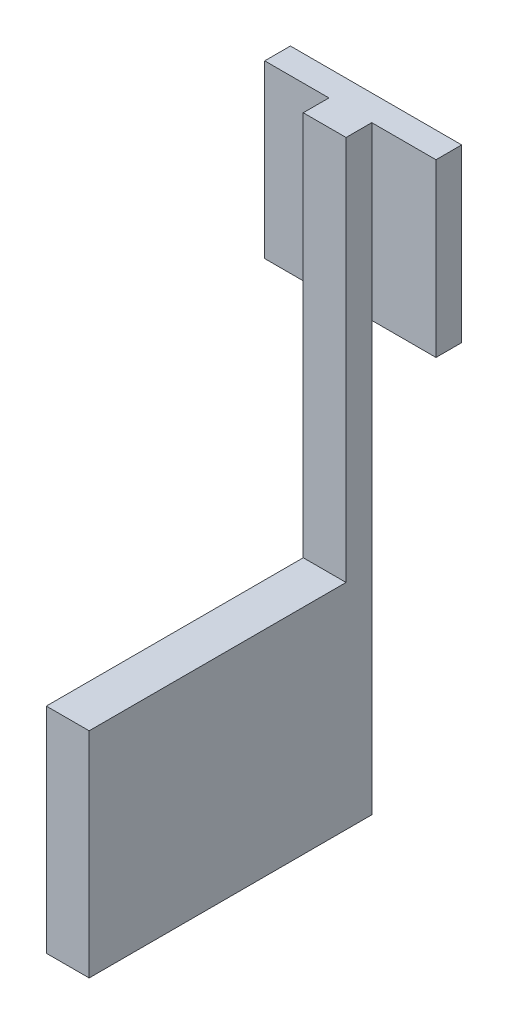
ISO-10303-21;
HEADER;
FILE_DESCRIPTION(('STEP AP214'),'2;1');
FILE_NAME('part.step','',(''),(''),'','','');
FILE_SCHEMA(('AUTOMOTIVE_DESIGN { 1 0 10303 214 1 1 1 1 }'));
ENDSEC;
DATA;
#1=APPLICATION_CONTEXT('core data for automotive mechanical design processes');
#2=APPLICATION_PROTOCOL_DEFINITION('international standard','automotive_design',2000,#1);
#3=PRODUCT_CONTEXT('',#1,'mechanical');
#4=PRODUCT('Part','Part','',(#3));
#5=PRODUCT_RELATED_PRODUCT_CATEGORY('part','',(#4));
#6=PRODUCT_DEFINITION_FORMATION('','',#4);
#7=PRODUCT_DEFINITION_CONTEXT('part definition',#1,'design');
#8=PRODUCT_DEFINITION('design','',#6,#7);
#9=PRODUCT_DEFINITION_SHAPE('','',#8);
#10=(LENGTH_UNIT() NAMED_UNIT(*) SI_UNIT(.MILLI.,.METRE.));
#11=(NAMED_UNIT(*) PLANE_ANGLE_UNIT() SI_UNIT($,.RADIAN.));
#12=(NAMED_UNIT(*) SI_UNIT($,.STERADIAN.) SOLID_ANGLE_UNIT());
#13=UNCERTAINTY_MEASURE_WITH_UNIT(LENGTH_MEASURE(1.E-05),#10,'distance_accuracy_value','');
#14=(GEOMETRIC_REPRESENTATION_CONTEXT(3) GLOBAL_UNCERTAINTY_ASSIGNED_CONTEXT((#13)) GLOBAL_UNIT_ASSIGNED_CONTEXT((#10,
#11,#12)) REPRESENTATION_CONTEXT('',''));
#15=CARTESIAN_POINT('',(0.,0.,0.));
#16=DIRECTION('',(0.,0.,1.));
#17=DIRECTION('',(1.,0.,0.));
#18=AXIS2_PLACEMENT_3D('',#15,#16,#17);
#19=CARTESIAN_POINT('',(0.,0.,6.));
#20=DIRECTION('',(0.,0.,-1.));
#21=DIRECTION('',(-1.,0.,0.));
#22=AXIS2_PLACEMENT_3D('',#19,#20,#21);
#23=PLANE('',#22);
#24=DIRECTION('',(-1.,0.,0.));
#25=VECTOR('',#24,1.);
#26=CARTESIAN_POINT('',(2.5,-35.,6.));
#27=LINE('',#26,#25);
#28=CARTESIAN_POINT('',(2.5,-35.,6.));
#29=VERTEX_POINT('',#28);
#30=CARTESIAN_POINT('',(-2.5,-35.,6.));
#31=VERTEX_POINT('',#30);
#32=EDGE_CURVE('E55',#29,#31,#27,.T.);
#33=ORIENTED_EDGE('',*,*,#32,.F.);
#34=DIRECTION('',(0.,1.,0.));
#35=VECTOR('',#34,1.);
#36=CARTESIAN_POINT('',(2.5,-10.,6.));
#37=LINE('',#36,#35);
#38=CARTESIAN_POINT('',(2.5,10.,6.));
#39=VERTEX_POINT('',#38);
#40=EDGE_CURVE('E150',#29,#39,#37,.T.);
#41=ORIENTED_EDGE('',*,*,#40,.T.);
#42=DIRECTION('',(-1.,0.,0.));
#43=VECTOR('',#42,1.);
#44=CARTESIAN_POINT('',(-2.5,10.,6.));
#45=LINE('',#44,#43);
#46=CARTESIAN_POINT('',(-2.5,10.,6.));
#47=VERTEX_POINT('',#46);
#48=EDGE_CURVE('E182',#39,#47,#45,.T.);
#49=ORIENTED_EDGE('',*,*,#48,.T.);
#50=DIRECTION('',(0.,-1.,0.));
#51=VECTOR('',#50,1.);
#52=CARTESIAN_POINT('',(-2.5,-10.,6.));
#53=LINE('',#52,#51);
#54=EDGE_CURVE('E185',#47,#31,#53,.T.);
#55=ORIENTED_EDGE('',*,*,#54,.T.);
#56=EDGE_LOOP('',(#33,#41,#49,#55));
#57=FACE_BOUND('',#56,.T.);
#58=ADVANCED_FACE('F39',(#57),#23,.F.);
#59=CARTESIAN_POINT('',(-10.,-10.,3.));
#60=DIRECTION('',(0.,1.,0.));
#61=DIRECTION('',(0.,0.,1.));
#62=AXIS2_PLACEMENT_3D('',#59,#60,#61);
#63=PLANE('',#62);
#64=DIRECTION('',(1.,0.,0.));
#65=VECTOR('',#64,1.);
#66=CARTESIAN_POINT('',(-2.5,-10.,3.));
#67=LINE('',#66,#65);
#68=CARTESIAN_POINT('',(-2.5,-10.,3.));
#69=VERTEX_POINT('',#68);
#70=CARTESIAN_POINT('',(2.5,-10.,3.));
#71=VERTEX_POINT('',#70);
#72=EDGE_CURVE('E152',#69,#71,#67,.T.);
#73=ORIENTED_EDGE('',*,*,#72,.F.);
#74=DIRECTION('',(1.,0.,0.));
#75=VECTOR('',#74,1.);
#76=CARTESIAN_POINT('',(-10.,-10.,3.));
#77=LINE('',#76,#75);
#78=CARTESIAN_POINT('',(-10.,-10.,3.));
#79=VERTEX_POINT('',#78);
#80=EDGE_CURVE('E214',#79,#69,#77,.T.);
#81=ORIENTED_EDGE('',*,*,#80,.F.);
#82=DIRECTION('',(0.,0.,-1.));
#83=VECTOR('',#82,1.);
#84=CARTESIAN_POINT('',(-10.,-10.,3.));
#85=LINE('',#84,#83);
#86=CARTESIAN_POINT('',(-10.,-10.,0.));
#87=VERTEX_POINT('',#86);
#88=EDGE_CURVE('E232',#79,#87,#85,.T.);
#89=ORIENTED_EDGE('',*,*,#88,.T.);
#90=DIRECTION('',(1.,0.,0.));
#91=VECTOR('',#90,1.);
#92=CARTESIAN_POINT('',(-10.,-10.,0.));
#93=LINE('',#92,#91);
#94=CARTESIAN_POINT('',(10.,-10.,0.));
#95=VERTEX_POINT('',#94);
#96=EDGE_CURVE('E206',#87,#95,#93,.T.);
#97=ORIENTED_EDGE('',*,*,#96,.T.);
#98=DIRECTION('',(0.,0.,-1.));
#99=VECTOR('',#98,1.);
#100=CARTESIAN_POINT('',(10.,-10.,3.));
#101=LINE('',#100,#99);
#102=CARTESIAN_POINT('',(10.,-10.,3.));
#103=VERTEX_POINT('',#102);
#104=EDGE_CURVE('E217',#103,#95,#101,.T.);
#105=ORIENTED_EDGE('',*,*,#104,.F.);
#106=EDGE_CURVE('E213',#71,#103,#77,.T.);
#107=ORIENTED_EDGE('',*,*,#106,.F.);
#108=EDGE_LOOP('',(#73,#81,#89,#97,#105,#107));
#109=FACE_BOUND('',#108,.T.);
#110=ADVANCED_FACE('F250',(#109),#63,.F.);
#111=CARTESIAN_POINT('',(0.,0.,3.));
#112=DIRECTION('',(0.,0.,-1.));
#113=DIRECTION('',(-1.,0.,0.));
#114=AXIS2_PLACEMENT_3D('',#111,#112,#113);
#115=PLANE('',#114);
#116=DIRECTION('',(0.,1.,0.));
#117=VECTOR('',#116,1.);
#118=CARTESIAN_POINT('',(2.5,-10.,3.));
#119=LINE('',#118,#117);
#120=CARTESIAN_POINT('',(2.5,10.,3.));
#121=VERTEX_POINT('',#120);
#122=EDGE_CURVE('E179',#71,#121,#119,.T.);
#123=ORIENTED_EDGE('',*,*,#122,.F.);
#124=ORIENTED_EDGE('',*,*,#106,.T.);
#125=DIRECTION('',(0.,1.,0.));
#126=VECTOR('',#125,1.);
#127=CARTESIAN_POINT('',(10.,-10.,3.));
#128=LINE('',#127,#126);
#129=CARTESIAN_POINT('',(10.,10.,3.));
#130=VERTEX_POINT('',#129);
#131=EDGE_CURVE('E201',#103,#130,#128,.T.);
#132=ORIENTED_EDGE('',*,*,#131,.T.);
#133=DIRECTION('',(-1.,0.,0.));
#134=VECTOR('',#133,1.);
#135=CARTESIAN_POINT('',(-10.,10.,3.));
#136=LINE('',#135,#134);
#137=EDGE_CURVE('E207',#130,#121,#136,.T.);
#138=ORIENTED_EDGE('',*,*,#137,.T.);
#139=EDGE_LOOP('',(#123,#124,#132,#138));
#140=FACE_BOUND('',#139,.T.);
#141=ADVANCED_FACE('F257',(#140),#115,.F.);
#142=DIRECTION('',(0.,-1.,0.));
#143=VECTOR('',#142,1.);
#144=CARTESIAN_POINT('',(-2.5,-10.,3.));
#145=LINE('',#144,#143);
#146=CARTESIAN_POINT('',(-2.5,10.,3.));
#147=VERTEX_POINT('',#146);
#148=EDGE_CURVE('E63',#147,#69,#145,.T.);
#149=ORIENTED_EDGE('',*,*,#148,.F.);
#150=CARTESIAN_POINT('',(-10.,10.,3.));
#151=VERTEX_POINT('',#150);
#152=EDGE_CURVE('E205',#147,#151,#136,.T.);
#153=ORIENTED_EDGE('',*,*,#152,.T.);
#154=DIRECTION('',(0.,-1.,0.));
#155=VECTOR('',#154,1.);
#156=CARTESIAN_POINT('',(-10.,-10.,3.));
#157=LINE('',#156,#155);
#158=EDGE_CURVE('E210',#151,#79,#157,.T.);
#159=ORIENTED_EDGE('',*,*,#158,.T.);
#160=ORIENTED_EDGE('',*,*,#80,.T.);
#161=EDGE_LOOP('',(#149,#153,#159,#160));
#162=FACE_BOUND('',#161,.T.);
#163=ADVANCED_FACE('F260',(#162),#115,.F.);
#164=CARTESIAN_POINT('',(10.,-10.,3.));
#165=DIRECTION('',(-1.,0.,0.));
#166=DIRECTION('',(0.,0.,1.));
#167=AXIS2_PLACEMENT_3D('',#164,#165,#166);
#168=PLANE('',#167);
#169=DIRECTION('',(0.,1.,0.));
#170=VECTOR('',#169,1.);
#171=CARTESIAN_POINT('',(10.,-10.,0.));
#172=LINE('',#171,#170);
#173=CARTESIAN_POINT('',(10.,10.,0.));
#174=VERTEX_POINT('',#173);
#175=EDGE_CURVE('E200',#95,#174,#172,.T.);
#176=ORIENTED_EDGE('',*,*,#175,.T.);
#177=DIRECTION('',(0.,0.,-1.));
#178=VECTOR('',#177,1.);
#179=CARTESIAN_POINT('',(10.,10.,3.));
#180=LINE('',#179,#178);
#181=EDGE_CURVE('E11',#130,#174,#180,.T.);
#182=ORIENTED_EDGE('',*,*,#181,.F.);
#183=ORIENTED_EDGE('',*,*,#131,.F.);
#184=ORIENTED_EDGE('',*,*,#104,.T.);
#185=EDGE_LOOP('',(#176,#182,#183,#184));
#186=FACE_BOUND('',#185,.T.);
#187=ADVANCED_FACE('F41',(#186),#168,.F.);
#188=CARTESIAN_POINT('',(-10.,10.,3.));
#189=DIRECTION('',(0.,-1.,0.));
#190=DIRECTION('',(0.,0.,-1.));
#191=AXIS2_PLACEMENT_3D('',#188,#189,#190);
#192=PLANE('',#191);
#193=DIRECTION('',(-1.,0.,0.));
#194=VECTOR('',#193,1.);
#195=CARTESIAN_POINT('',(-10.,10.,0.));
#196=LINE('',#195,#194);
#197=CARTESIAN_POINT('',(-10.,10.,0.));
#198=VERTEX_POINT('',#197);
#199=EDGE_CURVE('E221',#174,#198,#196,.T.);
#200=ORIENTED_EDGE('',*,*,#199,.T.);
#201=DIRECTION('',(0.,0.,-1.));
#202=VECTOR('',#201,1.);
#203=CARTESIAN_POINT('',(-10.,10.,3.));
#204=LINE('',#203,#202);
#205=EDGE_CURVE('E48',#151,#198,#204,.T.);
#206=ORIENTED_EDGE('',*,*,#205,.F.);
#207=ORIENTED_EDGE('',*,*,#152,.F.);
#208=DIRECTION('',(0.,0.,-1.));
#209=VECTOR('',#208,1.);
#210=CARTESIAN_POINT('',(-2.5,10.,6.));
#211=LINE('',#210,#209);
#212=EDGE_CURVE('E188',#47,#147,#211,.T.);
#213=ORIENTED_EDGE('',*,*,#212,.F.);
#214=ORIENTED_EDGE('',*,*,#48,.F.);
#215=DIRECTION('',(0.,0.,-1.));
#216=VECTOR('',#215,1.);
#217=CARTESIAN_POINT('',(2.5,10.,6.));
#218=LINE('',#217,#216);
#219=EDGE_CURVE('E196',#39,#121,#218,.T.);
#220=ORIENTED_EDGE('',*,*,#219,.T.);
#221=ORIENTED_EDGE('',*,*,#137,.F.);
#222=ORIENTED_EDGE('',*,*,#181,.T.);
#223=EDGE_LOOP('',(#200,#206,#207,#213,#214,#220,#221,#222));
#224=FACE_BOUND('',#223,.T.);
#225=ADVANCED_FACE('F262',(#224),#192,.F.);
#226=CARTESIAN_POINT('',(-10.,-10.,3.));
#227=DIRECTION('',(1.,0.,0.));
#228=DIRECTION('',(0.,0.,-1.));
#229=AXIS2_PLACEMENT_3D('',#226,#227,#228);
#230=PLANE('',#229);
#231=DIRECTION('',(0.,-1.,0.));
#232=VECTOR('',#231,1.);
#233=CARTESIAN_POINT('',(-10.,-10.,0.));
#234=LINE('',#233,#232);
#235=EDGE_CURVE('E224',#198,#87,#234,.T.);
#236=ORIENTED_EDGE('',*,*,#235,.T.);
#237=ORIENTED_EDGE('',*,*,#88,.F.);
#238=ORIENTED_EDGE('',*,*,#158,.F.);
#239=ORIENTED_EDGE('',*,*,#205,.T.);
#240=EDGE_LOOP('',(#236,#237,#238,#239));
#241=FACE_BOUND('',#240,.T.);
#242=ADVANCED_FACE('F241',(#241),#230,.F.);
#243=CARTESIAN_POINT('',(0.,0.,0.));
#244=DIRECTION('',(0.,0.,-1.));
#245=DIRECTION('',(-1.,0.,0.));
#246=AXIS2_PLACEMENT_3D('',#243,#244,#245);
#247=PLANE('',#246);
#248=ORIENTED_EDGE('',*,*,#175,.F.);
#249=ORIENTED_EDGE('',*,*,#96,.F.);
#250=ORIENTED_EDGE('',*,*,#235,.F.);
#251=ORIENTED_EDGE('',*,*,#199,.F.);
#252=EDGE_LOOP('',(#248,#249,#250,#251));
#253=FACE_BOUND('',#252,.T.);
#254=ADVANCED_FACE('F247',(#253),#247,.T.);
#255=CARTESIAN_POINT('',(2.5,-10.,6.));
#256=DIRECTION('',(-1.,0.,0.));
#257=DIRECTION('',(0.,0.,1.));
#258=AXIS2_PLACEMENT_3D('',#255,#256,#257);
#259=PLANE('',#258);
#260=ORIENTED_EDGE('',*,*,#122,.T.);
#261=ORIENTED_EDGE('',*,*,#219,.F.);
#262=ORIENTED_EDGE('',*,*,#40,.F.);
#263=DIRECTION('',(0.,0.,-1.));
#264=VECTOR('',#263,1.);
#265=CARTESIAN_POINT('',(2.5,-35.,36.));
#266=LINE('',#265,#264);
#267=CARTESIAN_POINT('',(2.5,-35.,36.));
#268=VERTEX_POINT('',#267);
#269=EDGE_CURVE('E128',#268,#29,#266,.T.);
#270=ORIENTED_EDGE('',*,*,#269,.F.);
#271=DIRECTION('',(0.,1.,0.));
#272=VECTOR('',#271,1.);
#273=CARTESIAN_POINT('',(2.5,-60.,36.));
#274=LINE('',#273,#272);
#275=CARTESIAN_POINT('',(2.5,-60.,36.));
#276=VERTEX_POINT('',#275);
#277=EDGE_CURVE('E136',#276,#268,#274,.T.);
#278=ORIENTED_EDGE('',*,*,#277,.F.);
#279=DIRECTION('',(0.,0.,1.));
#280=VECTOR('',#279,1.);
#281=CARTESIAN_POINT('',(2.5,-60.,6.));
#282=LINE('',#281,#280);
#283=CARTESIAN_POINT('',(2.5,-60.,3.));
#284=VERTEX_POINT('',#283);
#285=EDGE_CURVE('E168',#284,#276,#282,.T.);
#286=ORIENTED_EDGE('',*,*,#285,.F.);
#287=DIRECTION('',(0.,1.,0.));
#288=VECTOR('',#287,1.);
#289=CARTESIAN_POINT('',(2.5,-60.,3.));
#290=LINE('',#289,#288);
#291=EDGE_CURVE('E170',#284,#71,#290,.T.);
#292=ORIENTED_EDGE('',*,*,#291,.T.);
#293=EDGE_LOOP('',(#260,#261,#262,#270,#278,#286,#292));
#294=FACE_BOUND('',#293,.T.);
#295=ADVANCED_FACE('F148',(#294),#259,.F.);
#296=CARTESIAN_POINT('',(-2.5,-10.,6.));
#297=DIRECTION('',(1.,0.,0.));
#298=DIRECTION('',(0.,0.,-1.));
#299=AXIS2_PLACEMENT_3D('',#296,#297,#298);
#300=PLANE('',#299);
#301=ORIENTED_EDGE('',*,*,#148,.T.);
#302=DIRECTION('',(0.,1.,0.));
#303=VECTOR('',#302,1.);
#304=CARTESIAN_POINT('',(-2.5,-60.,3.));
#305=LINE('',#304,#303);
#306=CARTESIAN_POINT('',(-2.5,-60.,3.));
#307=VERTEX_POINT('',#306);
#308=EDGE_CURVE('E175',#307,#69,#305,.T.);
#309=ORIENTED_EDGE('',*,*,#308,.F.);
#310=DIRECTION('',(0.,0.,-1.));
#311=VECTOR('',#310,1.);
#312=CARTESIAN_POINT('',(-2.5,-60.,6.));
#313=LINE('',#312,#311);
#314=CARTESIAN_POINT('',(-2.5,-60.,36.));
#315=VERTEX_POINT('',#314);
#316=EDGE_CURVE('E157',#315,#307,#313,.T.);
#317=ORIENTED_EDGE('',*,*,#316,.F.);
#318=DIRECTION('',(0.,-1.,0.));
#319=VECTOR('',#318,1.);
#320=CARTESIAN_POINT('',(-2.5,-60.,36.));
#321=LINE('',#320,#319);
#322=CARTESIAN_POINT('',(-2.5,-35.,36.));
#323=VERTEX_POINT('',#322);
#324=EDGE_CURVE('E135',#323,#315,#321,.T.);
#325=ORIENTED_EDGE('',*,*,#324,.F.);
#326=DIRECTION('',(0.,0.,-1.));
#327=VECTOR('',#326,1.);
#328=CARTESIAN_POINT('',(-2.5,-35.,36.));
#329=LINE('',#328,#327);
#330=EDGE_CURVE('E130',#323,#31,#329,.T.);
#331=ORIENTED_EDGE('',*,*,#330,.T.);
#332=ORIENTED_EDGE('',*,*,#54,.F.);
#333=ORIENTED_EDGE('',*,*,#212,.T.);
#334=EDGE_LOOP('',(#301,#309,#317,#325,#331,#332,#333));
#335=FACE_BOUND('',#334,.T.);
#336=ADVANCED_FACE('F266',(#335),#300,.F.);
#337=CARTESIAN_POINT('',(-2.5,-60.,3.));
#338=DIRECTION('',(0.,0.,1.));
#339=DIRECTION('',(1.,0.,0.));
#340=AXIS2_PLACEMENT_3D('',#337,#338,#339);
#341=PLANE('',#340);
#342=ORIENTED_EDGE('',*,*,#72,.T.);
#343=ORIENTED_EDGE('',*,*,#291,.F.);
#344=DIRECTION('',(1.,0.,0.));
#345=VECTOR('',#344,1.);
#346=CARTESIAN_POINT('',(-2.5,-60.,3.));
#347=LINE('',#346,#345);
#348=EDGE_CURVE('E165',#307,#284,#347,.T.);
#349=ORIENTED_EDGE('',*,*,#348,.F.);
#350=ORIENTED_EDGE('',*,*,#308,.T.);
#351=EDGE_LOOP('',(#342,#343,#349,#350));
#352=FACE_BOUND('',#351,.T.);
#353=ADVANCED_FACE('F277',(#352),#341,.F.);
#354=CARTESIAN_POINT('',(0.,-60.,0.));
#355=DIRECTION('',(0.,-1.,0.));
#356=DIRECTION('',(0.,0.,-1.));
#357=AXIS2_PLACEMENT_3D('',#354,#355,#356);
#358=PLANE('',#357);
#359=ORIENTED_EDGE('',*,*,#316,.T.);
#360=ORIENTED_EDGE('',*,*,#348,.T.);
#361=ORIENTED_EDGE('',*,*,#285,.T.);
#362=DIRECTION('',(1.,0.,0.));
#363=VECTOR('',#362,1.);
#364=CARTESIAN_POINT('',(2.5,-60.,36.));
#365=LINE('',#364,#363);
#366=EDGE_CURVE('E142',#315,#276,#365,.T.);
#367=ORIENTED_EDGE('',*,*,#366,.F.);
#368=EDGE_LOOP('',(#359,#360,#361,#367));
#369=FACE_BOUND('',#368,.T.);
#370=ADVANCED_FACE('F274',(#369),#358,.T.);
#371=CARTESIAN_POINT('',(2.5,-35.,36.));
#372=DIRECTION('',(0.,-1.,0.));
#373=DIRECTION('',(0.,0.,-1.));
#374=AXIS2_PLACEMENT_3D('',#371,#372,#373);
#375=PLANE('',#374);
#376=ORIENTED_EDGE('',*,*,#32,.T.);
#377=ORIENTED_EDGE('',*,*,#330,.F.);
#378=DIRECTION('',(-1.,0.,0.));
#379=VECTOR('',#378,1.);
#380=CARTESIAN_POINT('',(2.5,-35.,36.));
#381=LINE('',#380,#379);
#382=EDGE_CURVE('E124',#268,#323,#381,.T.);
#383=ORIENTED_EDGE('',*,*,#382,.F.);
#384=ORIENTED_EDGE('',*,*,#269,.T.);
#385=EDGE_LOOP('',(#376,#377,#383,#384));
#386=FACE_BOUND('',#385,.T.);
#387=ADVANCED_FACE('F126',(#386),#375,.F.);
#388=CARTESIAN_POINT('',(0.,0.,36.));
#389=DIRECTION('',(0.,0.,1.));
#390=DIRECTION('',(1.,0.,0.));
#391=AXIS2_PLACEMENT_3D('',#388,#389,#390);
#392=PLANE('',#391);
#393=ORIENTED_EDGE('',*,*,#277,.T.);
#394=ORIENTED_EDGE('',*,*,#382,.T.);
#395=ORIENTED_EDGE('',*,*,#324,.T.);
#396=ORIENTED_EDGE('',*,*,#366,.T.);
#397=EDGE_LOOP('',(#393,#394,#395,#396));
#398=FACE_BOUND('',#397,.T.);
#399=ADVANCED_FACE('F140',(#398),#392,.T.);
#400=CLOSED_SHELL('',(#58,#110,#141,#163,#187,#225,#242,#254,#295,#336,#353,#370,#387,#399));
#401=MANIFOLD_SOLID_BREP('B2',#400);
#402=ADVANCED_BREP_SHAPE_REPRESENTATION('',(#18,#401),#14);
#403=SHAPE_DEFINITION_REPRESENTATION(#9,#402);
ENDSEC;
END-ISO-10303-21;
